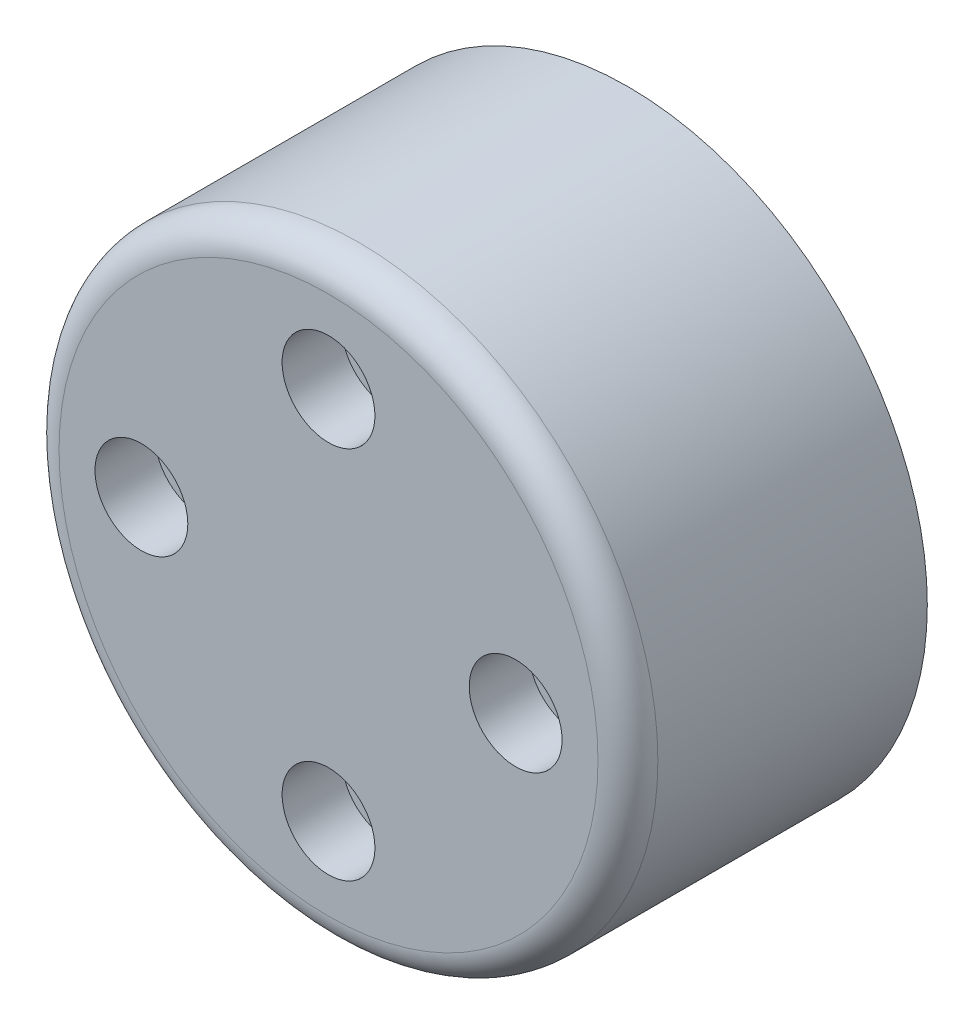
ISO-10303-21;
HEADER;
FILE_DESCRIPTION(('STEP AP214'),'2;1');
FILE_NAME('part.step','',(''),(''),'','','');
FILE_SCHEMA(('AUTOMOTIVE_DESIGN { 1 0 10303 214 1 1 1 1 }'));
ENDSEC;
DATA;
#1=APPLICATION_CONTEXT('core data for automotive mechanical design processes');
#2=APPLICATION_PROTOCOL_DEFINITION('international standard','automotive_design',2000,#1);
#3=PRODUCT_CONTEXT('',#1,'mechanical');
#4=PRODUCT('Part','Part','',(#3));
#5=PRODUCT_RELATED_PRODUCT_CATEGORY('part','',(#4));
#6=PRODUCT_DEFINITION_FORMATION('','',#4);
#7=PRODUCT_DEFINITION_CONTEXT('part definition',#1,'design');
#8=PRODUCT_DEFINITION('design','',#6,#7);
#9=PRODUCT_DEFINITION_SHAPE('','',#8);
#10=(LENGTH_UNIT() NAMED_UNIT(*) SI_UNIT(.MILLI.,.METRE.));
#11=(NAMED_UNIT(*) PLANE_ANGLE_UNIT() SI_UNIT($,.RADIAN.));
#12=(NAMED_UNIT(*) SI_UNIT($,.STERADIAN.) SOLID_ANGLE_UNIT());
#13=UNCERTAINTY_MEASURE_WITH_UNIT(LENGTH_MEASURE(1.E-05),#10,'distance_accuracy_value','');
#14=(GEOMETRIC_REPRESENTATION_CONTEXT(3) GLOBAL_UNCERTAINTY_ASSIGNED_CONTEXT((#13)) GLOBAL_UNIT_ASSIGNED_CONTEXT((#10,
#11,#12)) REPRESENTATION_CONTEXT('',''));
#15=CARTESIAN_POINT('',(0.,0.,0.));
#16=DIRECTION('',(0.,0.,1.));
#17=DIRECTION('',(1.,0.,0.));
#18=AXIS2_PLACEMENT_3D('',#15,#16,#17);
#19=CARTESIAN_POINT('',(12.5,0.,20.));
#20=DIRECTION('',(0.,0.,-1.));
#21=DIRECTION('',(-1.,0.,0.));
#22=AXIS2_PLACEMENT_3D('',#19,#20,#21);
#23=CYLINDRICAL_SURFACE('',#22,1.6);
#24=CARTESIAN_POINT('',(12.5,0.,0.));
#25=DIRECTION('',(0.,0.,1.));
#26=DIRECTION('',(1.,0.,0.));
#27=AXIS2_PLACEMENT_3D('',#24,#25,#26);
#28=CIRCLE('',#27,1.6);
#29=CARTESIAN_POINT('',(14.1,0.,0.));
#30=VERTEX_POINT('',#29);
#31=EDGE_CURVE('E58',#30,#30,#28,.T.);
#32=ORIENTED_EDGE('',*,*,#31,.F.);
#33=EDGE_LOOP('',(#32));
#34=FACE_BOUND('',#33,.T.);
#35=CARTESIAN_POINT('',(12.5,0.,16.));
#36=DIRECTION('',(0.,0.,1.));
#37=DIRECTION('',(1.,0.,0.));
#38=AXIS2_PLACEMENT_3D('',#35,#36,#37);
#39=CIRCLE('',#38,1.6);
#40=CARTESIAN_POINT('',(14.1,0.,16.));
#41=VERTEX_POINT('',#40);
#42=EDGE_CURVE('E61',#41,#41,#39,.T.);
#43=ORIENTED_EDGE('',*,*,#42,.T.);
#44=EDGE_LOOP('',(#43));
#45=FACE_BOUND('',#44,.T.);
#46=ADVANCED_FACE('F40',(#34,#45),#23,.F.);
#47=CARTESIAN_POINT('',(0.,-12.5,20.));
#48=DIRECTION('',(0.,0.,-1.));
#49=DIRECTION('',(-1.,0.,0.));
#50=AXIS2_PLACEMENT_3D('',#47,#48,#49);
#51=CYLINDRICAL_SURFACE('',#50,1.6);
#52=CARTESIAN_POINT('',(0.,-12.5,0.));
#53=DIRECTION('',(0.,0.,1.));
#54=DIRECTION('',(1.,0.,0.));
#55=AXIS2_PLACEMENT_3D('',#52,#53,#54);
#56=CIRCLE('',#55,1.6);
#57=CARTESIAN_POINT('',(1.6,-12.5,0.));
#58=VERTEX_POINT('',#57);
#59=EDGE_CURVE('E82',#58,#58,#56,.T.);
#60=ORIENTED_EDGE('',*,*,#59,.F.);
#61=EDGE_LOOP('',(#60));
#62=FACE_BOUND('',#61,.T.);
#63=CARTESIAN_POINT('',(0.,-12.5,16.));
#64=DIRECTION('',(0.,0.,1.));
#65=DIRECTION('',(1.,0.,0.));
#66=AXIS2_PLACEMENT_3D('',#63,#64,#65);
#67=CIRCLE('',#66,1.6);
#68=CARTESIAN_POINT('',(1.6,-12.5,16.));
#69=VERTEX_POINT('',#68);
#70=EDGE_CURVE('E66',#69,#69,#67,.T.);
#71=ORIENTED_EDGE('',*,*,#70,.T.);
#72=EDGE_LOOP('',(#71));
#73=FACE_BOUND('',#72,.T.);
#74=ADVANCED_FACE('F207',(#62,#73),#51,.F.);
#75=CARTESIAN_POINT('',(-12.5,0.,20.));
#76=DIRECTION('',(0.,0.,-1.));
#77=DIRECTION('',(-1.,0.,0.));
#78=AXIS2_PLACEMENT_3D('',#75,#76,#77);
#79=CYLINDRICAL_SURFACE('',#78,1.6);
#80=CARTESIAN_POINT('',(-12.5,0.,0.));
#81=DIRECTION('',(0.,0.,1.));
#82=DIRECTION('',(-1.,0.,0.));
#83=AXIS2_PLACEMENT_3D('',#80,#81,#82);
#84=CIRCLE('',#83,1.6);
#85=CARTESIAN_POINT('',(-14.1,0.,0.));
#86=VERTEX_POINT('',#85);
#87=EDGE_CURVE('E86',#86,#86,#84,.T.);
#88=ORIENTED_EDGE('',*,*,#87,.F.);
#89=EDGE_LOOP('',(#88));
#90=FACE_BOUND('',#89,.T.);
#91=CARTESIAN_POINT('',(-12.5,0.,16.));
#92=DIRECTION('',(0.,0.,1.));
#93=DIRECTION('',(1.,0.,0.));
#94=AXIS2_PLACEMENT_3D('',#91,#92,#93);
#95=CIRCLE('',#94,1.6);
#96=CARTESIAN_POINT('',(-10.9,0.,16.));
#97=VERTEX_POINT('',#96);
#98=EDGE_CURVE('E70',#97,#97,#95,.T.);
#99=ORIENTED_EDGE('',*,*,#98,.T.);
#100=EDGE_LOOP('',(#99));
#101=FACE_BOUND('',#100,.T.);
#102=ADVANCED_FACE('F181',(#90,#101),#79,.F.);
#103=CARTESIAN_POINT('',(0.,12.5,20.));
#104=DIRECTION('',(0.,0.,-1.));
#105=DIRECTION('',(-1.,0.,0.));
#106=AXIS2_PLACEMENT_3D('',#103,#104,#105);
#107=CYLINDRICAL_SURFACE('',#106,1.6);
#108=CARTESIAN_POINT('',(0.,12.5,0.));
#109=DIRECTION('',(0.,0.,1.));
#110=DIRECTION('',(-1.,0.,0.));
#111=AXIS2_PLACEMENT_3D('',#108,#109,#110);
#112=CIRCLE('',#111,1.6);
#113=CARTESIAN_POINT('',(-1.6,12.5,0.));
#114=VERTEX_POINT('',#113);
#115=EDGE_CURVE('E65',#114,#114,#112,.T.);
#116=ORIENTED_EDGE('',*,*,#115,.F.);
#117=EDGE_LOOP('',(#116));
#118=FACE_BOUND('',#117,.T.);
#119=CARTESIAN_POINT('',(0.,12.5,16.));
#120=DIRECTION('',(0.,0.,1.));
#121=DIRECTION('',(1.,0.,0.));
#122=AXIS2_PLACEMENT_3D('',#119,#120,#121);
#123=CIRCLE('',#122,1.6);
#124=CARTESIAN_POINT('',(1.6,12.5,16.));
#125=VERTEX_POINT('',#124);
#126=EDGE_CURVE('E74',#125,#125,#123,.T.);
#127=ORIENTED_EDGE('',*,*,#126,.T.);
#128=EDGE_LOOP('',(#127));
#129=FACE_BOUND('',#128,.T.);
#130=ADVANCED_FACE('F178',(#118,#129),#107,.F.);
#131=CARTESIAN_POINT('',(0.,0.,20.));
#132=DIRECTION('',(0.,0.,1.));
#133=DIRECTION('',(1.,0.,0.));
#134=AXIS2_PLACEMENT_3D('',#131,#132,#133);
#135=PLANE('',#134);
#136=CARTESIAN_POINT('',(0.,0.,20.));
#137=DIRECTION('',(0.,0.,1.));
#138=DIRECTION('',(1.,0.,0.));
#139=AXIS2_PLACEMENT_3D('',#136,#137,#138);
#140=CIRCLE('',#139,18.);
#141=CARTESIAN_POINT('',(18.,0.,20.));
#142=VERTEX_POINT('',#141);
#143=EDGE_CURVE('E48',#142,#142,#140,.T.);
#144=ORIENTED_EDGE('',*,*,#143,.T.);
#145=EDGE_LOOP('',(#144));
#146=FACE_BOUND('',#145,.T.);
#147=CARTESIAN_POINT('',(-12.5,0.,20.));
#148=DIRECTION('',(0.,0.,1.));
#149=DIRECTION('',(1.,0.,0.));
#150=AXIS2_PLACEMENT_3D('',#147,#148,#149);
#151=CIRCLE('',#150,3.1);
#152=CARTESIAN_POINT('',(-9.4,0.,20.));
#153=VERTEX_POINT('',#152);
#154=EDGE_CURVE('E118',#153,#153,#151,.T.);
#155=ORIENTED_EDGE('',*,*,#154,.F.);
#156=EDGE_LOOP('',(#155));
#157=FACE_BOUND('',#156,.T.);
#158=CARTESIAN_POINT('',(0.,-12.5,20.));
#159=DIRECTION('',(0.,0.,1.));
#160=DIRECTION('',(1.,0.,0.));
#161=AXIS2_PLACEMENT_3D('',#158,#159,#160);
#162=CIRCLE('',#161,3.1);
#163=CARTESIAN_POINT('',(3.1,-12.5,20.));
#164=VERTEX_POINT('',#163);
#165=EDGE_CURVE('E114',#164,#164,#162,.T.);
#166=ORIENTED_EDGE('',*,*,#165,.F.);
#167=EDGE_LOOP('',(#166));
#168=FACE_BOUND('',#167,.T.);
#169=CARTESIAN_POINT('',(12.5,0.,20.));
#170=DIRECTION('',(0.,0.,1.));
#171=DIRECTION('',(1.,0.,0.));
#172=AXIS2_PLACEMENT_3D('',#169,#170,#171);
#173=CIRCLE('',#172,3.1);
#174=CARTESIAN_POINT('',(15.6,0.,20.));
#175=VERTEX_POINT('',#174);
#176=EDGE_CURVE('E106',#175,#175,#173,.T.);
#177=ORIENTED_EDGE('',*,*,#176,.F.);
#178=EDGE_LOOP('',(#177));
#179=FACE_BOUND('',#178,.T.);
#180=CARTESIAN_POINT('',(0.,12.5,20.));
#181=DIRECTION('',(0.,0.,1.));
#182=DIRECTION('',(1.,0.,0.));
#183=AXIS2_PLACEMENT_3D('',#180,#181,#182);
#184=CIRCLE('',#183,3.1);
#185=CARTESIAN_POINT('',(3.1,12.5,20.));
#186=VERTEX_POINT('',#185);
#187=EDGE_CURVE('E97',#186,#186,#184,.T.);
#188=ORIENTED_EDGE('',*,*,#187,.F.);
#189=EDGE_LOOP('',(#188));
#190=FACE_BOUND('',#189,.T.);
#191=ADVANCED_FACE('F163',(#146,#157,#168,#179,#190),#135,.T.);
#192=CARTESIAN_POINT('',(0.,0.,0.));
#193=DIRECTION('',(0.,0.,1.));
#194=DIRECTION('',(1.,0.,0.));
#195=AXIS2_PLACEMENT_3D('',#192,#193,#194);
#196=PLANE('',#195);
#197=CARTESIAN_POINT('',(6.71751442127223,-6.71751442127217,0.));
#198=DIRECTION('',(0.,0.,-1.));
#199=DIRECTION('',(-1.,0.,0.));
#200=AXIS2_PLACEMENT_3D('',#197,#198,#199);
#201=CIRCLE('',#200,3.1);
#202=CARTESIAN_POINT('',(3.61751442127223,-6.71751442127217,0.));
#203=VERTEX_POINT('',#202);
#204=EDGE_CURVE('E137',#203,#203,#201,.T.);
#205=ORIENTED_EDGE('',*,*,#204,.F.);
#206=EDGE_LOOP('',(#205));
#207=FACE_BOUND('',#206,.T.);
#208=CARTESIAN_POINT('',(-6.71751442127219,-6.71751442127221,0.));
#209=DIRECTION('',(0.,0.,-1.));
#210=DIRECTION('',(-1.,0.,0.));
#211=AXIS2_PLACEMENT_3D('',#208,#209,#210);
#212=CIRCLE('',#211,3.1);
#213=CARTESIAN_POINT('',(-9.81751442127219,-6.71751442127221,0.));
#214=VERTEX_POINT('',#213);
#215=EDGE_CURVE('E145',#214,#214,#212,.T.);
#216=ORIENTED_EDGE('',*,*,#215,.F.);
#217=EDGE_LOOP('',(#216));
#218=FACE_BOUND('',#217,.T.);
#219=CARTESIAN_POINT('',(-6.71751442127218,6.71751442127217,0.));
#220=DIRECTION('',(0.,0.,-1.));
#221=DIRECTION('',(-1.,0.,0.));
#222=AXIS2_PLACEMENT_3D('',#219,#220,#221);
#223=CIRCLE('',#222,3.1);
#224=CARTESIAN_POINT('',(-9.81751442127218,6.71751442127217,0.));
#225=VERTEX_POINT('',#224);
#226=EDGE_CURVE('E129',#225,#225,#223,.T.);
#227=ORIENTED_EDGE('',*,*,#226,.F.);
#228=EDGE_LOOP('',(#227));
#229=FACE_BOUND('',#228,.T.);
#230=CARTESIAN_POINT('',(6.71751442127224,6.71751442127216,0.));
#231=DIRECTION('',(0.,0.,-1.));
#232=DIRECTION('',(-1.,0.,0.));
#233=AXIS2_PLACEMENT_3D('',#230,#231,#232);
#234=CIRCLE('',#233,3.1);
#235=CARTESIAN_POINT('',(3.61751442127224,6.71751442127216,0.));
#236=VERTEX_POINT('',#235);
#237=EDGE_CURVE('E125',#236,#236,#234,.T.);
#238=ORIENTED_EDGE('',*,*,#237,.F.);
#239=EDGE_LOOP('',(#238));
#240=FACE_BOUND('',#239,.T.);
#241=CARTESIAN_POINT('',(0.,0.,0.));
#242=DIRECTION('',(0.,0.,1.));
#243=DIRECTION('',(1.,0.,0.));
#244=AXIS2_PLACEMENT_3D('',#241,#242,#243);
#245=CIRCLE('',#244,20.);
#246=CARTESIAN_POINT('',(20.,0.,0.));
#247=VERTEX_POINT('',#246);
#248=EDGE_CURVE('E53',#247,#247,#245,.T.);
#249=ORIENTED_EDGE('',*,*,#248,.F.);
#250=EDGE_LOOP('',(#249));
#251=FACE_BOUND('',#250,.T.);
#252=ORIENTED_EDGE('',*,*,#31,.T.);
#253=EDGE_LOOP('',(#252));
#254=FACE_BOUND('',#253,.T.);
#255=ORIENTED_EDGE('',*,*,#59,.T.);
#256=EDGE_LOOP('',(#255));
#257=FACE_BOUND('',#256,.T.);
#258=ORIENTED_EDGE('',*,*,#87,.T.);
#259=EDGE_LOOP('',(#258));
#260=FACE_BOUND('',#259,.T.);
#261=ORIENTED_EDGE('',*,*,#115,.T.);
#262=EDGE_LOOP('',(#261));
#263=FACE_BOUND('',#262,.T.);
#264=ADVANCED_FACE('F159',(#207,#218,#229,#240,#251,#254,#257,#260,#263),#196,.F.);
#265=CARTESIAN_POINT('',(0.,0.,20.));
#266=DIRECTION('',(0.,0.,-1.));
#267=DIRECTION('',(-1.,0.,0.));
#268=AXIS2_PLACEMENT_3D('',#265,#266,#267);
#269=CYLINDRICAL_SURFACE('',#268,20.);
#270=CARTESIAN_POINT('',(0.,0.,18.));
#271=DIRECTION('',(0.,0.,1.));
#272=DIRECTION('',(1.,0.,0.));
#273=AXIS2_PLACEMENT_3D('',#270,#271,#272);
#274=CIRCLE('',#273,20.);
#275=CARTESIAN_POINT('',(20.,0.,18.));
#276=VERTEX_POINT('',#275);
#277=EDGE_CURVE('E10',#276,#276,#274,.F.);
#278=ORIENTED_EDGE('',*,*,#277,.T.);
#279=EDGE_LOOP('',(#278));
#280=FACE_BOUND('',#279,.T.);
#281=ORIENTED_EDGE('',*,*,#248,.T.);
#282=EDGE_LOOP('',(#281));
#283=FACE_BOUND('',#282,.T.);
#284=ADVANCED_FACE('F162',(#280,#283),#269,.T.);
#285=CARTESIAN_POINT('',(0.,12.5,16.));
#286=DIRECTION('',(0.,0.,1.));
#287=DIRECTION('',(1.,0.,0.));
#288=AXIS2_PLACEMENT_3D('',#285,#286,#287);
#289=CYLINDRICAL_SURFACE('',#288,3.1);
#290=CARTESIAN_POINT('',(0.,12.5,16.));
#291=DIRECTION('',(0.,0.,1.));
#292=DIRECTION('',(1.,0.,0.));
#293=AXIS2_PLACEMENT_3D('',#290,#291,#292);
#294=CIRCLE('',#293,3.1);
#295=CARTESIAN_POINT('',(3.1,12.5,16.));
#296=VERTEX_POINT('',#295);
#297=EDGE_CURVE('E93',#296,#296,#294,.T.);
#298=ORIENTED_EDGE('',*,*,#297,.F.);
#299=EDGE_LOOP('',(#298));
#300=FACE_BOUND('',#299,.T.);
#301=ORIENTED_EDGE('',*,*,#187,.T.);
#302=EDGE_LOOP('',(#301));
#303=FACE_BOUND('',#302,.T.);
#304=ADVANCED_FACE('F189',(#300,#303),#289,.F.);
#305=CARTESIAN_POINT('',(0.,12.5,16.));
#306=DIRECTION('',(0.,0.,1.));
#307=DIRECTION('',(1.,0.,0.));
#308=AXIS2_PLACEMENT_3D('',#305,#306,#307);
#309=PLANE('',#308);
#310=ORIENTED_EDGE('',*,*,#126,.F.);
#311=EDGE_LOOP('',(#310));
#312=FACE_BOUND('',#311,.T.);
#313=ORIENTED_EDGE('',*,*,#297,.T.);
#314=EDGE_LOOP('',(#313));
#315=FACE_BOUND('',#314,.T.);
#316=ADVANCED_FACE('F185',(#312,#315),#309,.T.);
#317=CARTESIAN_POINT('',(-12.5,0.,16.));
#318=DIRECTION('',(0.,0.,1.));
#319=DIRECTION('',(1.,0.,0.));
#320=AXIS2_PLACEMENT_3D('',#317,#318,#319);
#321=CYLINDRICAL_SURFACE('',#320,3.1);
#322=CARTESIAN_POINT('',(-12.5,0.,16.));
#323=DIRECTION('',(0.,0.,1.));
#324=DIRECTION('',(1.,0.,0.));
#325=AXIS2_PLACEMENT_3D('',#322,#323,#324);
#326=CIRCLE('',#325,3.1);
#327=CARTESIAN_POINT('',(-9.4,0.,16.));
#328=VERTEX_POINT('',#327);
#329=EDGE_CURVE('E77',#328,#328,#326,.T.);
#330=ORIENTED_EDGE('',*,*,#329,.F.);
#331=EDGE_LOOP('',(#330));
#332=FACE_BOUND('',#331,.T.);
#333=ORIENTED_EDGE('',*,*,#154,.T.);
#334=EDGE_LOOP('',(#333));
#335=FACE_BOUND('',#334,.T.);
#336=ADVANCED_FACE('F188',(#332,#335),#321,.F.);
#337=CARTESIAN_POINT('',(-12.5,0.,16.));
#338=DIRECTION('',(0.,0.,1.));
#339=DIRECTION('',(1.,0.,0.));
#340=AXIS2_PLACEMENT_3D('',#337,#338,#339);
#341=PLANE('',#340);
#342=ORIENTED_EDGE('',*,*,#98,.F.);
#343=EDGE_LOOP('',(#342));
#344=FACE_BOUND('',#343,.T.);
#345=ORIENTED_EDGE('',*,*,#329,.T.);
#346=EDGE_LOOP('',(#345));
#347=FACE_BOUND('',#346,.T.);
#348=ADVANCED_FACE('F235',(#344,#347),#341,.T.);
#349=CARTESIAN_POINT('',(0.,-12.5,16.));
#350=DIRECTION('',(0.,0.,1.));
#351=DIRECTION('',(1.,0.,0.));
#352=AXIS2_PLACEMENT_3D('',#349,#350,#351);
#353=CYLINDRICAL_SURFACE('',#352,3.1);
#354=CARTESIAN_POINT('',(0.,-12.5,16.));
#355=DIRECTION('',(0.,0.,1.));
#356=DIRECTION('',(1.,0.,0.));
#357=AXIS2_PLACEMENT_3D('',#354,#355,#356);
#358=CIRCLE('',#357,3.1);
#359=CARTESIAN_POINT('',(3.1,-12.5,16.));
#360=VERTEX_POINT('',#359);
#361=EDGE_CURVE('E110',#360,#360,#358,.T.);
#362=ORIENTED_EDGE('',*,*,#361,.F.);
#363=EDGE_LOOP('',(#362));
#364=FACE_BOUND('',#363,.T.);
#365=ORIENTED_EDGE('',*,*,#165,.T.);
#366=EDGE_LOOP('',(#365));
#367=FACE_BOUND('',#366,.T.);
#368=ADVANCED_FACE('F231',(#364,#367),#353,.F.);
#369=CARTESIAN_POINT('',(0.,-12.5,16.));
#370=DIRECTION('',(0.,0.,1.));
#371=DIRECTION('',(1.,0.,0.));
#372=AXIS2_PLACEMENT_3D('',#369,#370,#371);
#373=PLANE('',#372);
#374=ORIENTED_EDGE('',*,*,#70,.F.);
#375=EDGE_LOOP('',(#374));
#376=FACE_BOUND('',#375,.T.);
#377=ORIENTED_EDGE('',*,*,#361,.T.);
#378=EDGE_LOOP('',(#377));
#379=FACE_BOUND('',#378,.T.);
#380=ADVANCED_FACE('F227',(#376,#379),#373,.T.);
#381=CARTESIAN_POINT('',(12.5,0.,16.));
#382=DIRECTION('',(0.,0.,1.));
#383=DIRECTION('',(1.,0.,0.));
#384=AXIS2_PLACEMENT_3D('',#381,#382,#383);
#385=CYLINDRICAL_SURFACE('',#384,3.1);
#386=CARTESIAN_POINT('',(12.5,0.,16.));
#387=DIRECTION('',(0.,0.,1.));
#388=DIRECTION('',(1.,0.,0.));
#389=AXIS2_PLACEMENT_3D('',#386,#387,#388);
#390=CIRCLE('',#389,3.1);
#391=CARTESIAN_POINT('',(15.6,0.,16.));
#392=VERTEX_POINT('',#391);
#393=EDGE_CURVE('E102',#392,#392,#390,.T.);
#394=ORIENTED_EDGE('',*,*,#393,.F.);
#395=EDGE_LOOP('',(#394));
#396=FACE_BOUND('',#395,.T.);
#397=ORIENTED_EDGE('',*,*,#176,.T.);
#398=EDGE_LOOP('',(#397));
#399=FACE_BOUND('',#398,.T.);
#400=ADVANCED_FACE('F223',(#396,#399),#385,.F.);
#401=CARTESIAN_POINT('',(12.5,0.,16.));
#402=DIRECTION('',(0.,0.,1.));
#403=DIRECTION('',(1.,0.,0.));
#404=AXIS2_PLACEMENT_3D('',#401,#402,#403);
#405=PLANE('',#404);
#406=ORIENTED_EDGE('',*,*,#42,.F.);
#407=EDGE_LOOP('',(#406));
#408=FACE_BOUND('',#407,.T.);
#409=ORIENTED_EDGE('',*,*,#393,.T.);
#410=EDGE_LOOP('',(#409));
#411=FACE_BOUND('',#410,.T.);
#412=ADVANCED_FACE('F219',(#408,#411),#405,.T.);
#413=CARTESIAN_POINT('',(6.71751442127224,6.71751442127216,5.));
#414=DIRECTION('',(0.,0.,-1.));
#415=DIRECTION('',(-1.,0.,0.));
#416=AXIS2_PLACEMENT_3D('',#413,#414,#415);
#417=CYLINDRICAL_SURFACE('',#416,3.1);
#418=CARTESIAN_POINT('',(6.71751442127224,6.71751442127216,5.));
#419=DIRECTION('',(0.,0.,-1.));
#420=DIRECTION('',(-1.,0.,0.));
#421=AXIS2_PLACEMENT_3D('',#418,#419,#420);
#422=CIRCLE('',#421,3.1);
#423=CARTESIAN_POINT('',(3.61751442127224,6.71751442127216,5.));
#424=VERTEX_POINT('',#423);
#425=EDGE_CURVE('E98',#424,#424,#422,.T.);
#426=ORIENTED_EDGE('',*,*,#425,.F.);
#427=EDGE_LOOP('',(#426));
#428=FACE_BOUND('',#427,.T.);
#429=ORIENTED_EDGE('',*,*,#237,.T.);
#430=EDGE_LOOP('',(#429));
#431=FACE_BOUND('',#430,.T.);
#432=ADVANCED_FACE('F222',(#428,#431),#417,.F.);
#433=CARTESIAN_POINT('',(6.71751442127224,6.71751442127216,5.));
#434=DIRECTION('',(0.,0.,-1.));
#435=DIRECTION('',(-1.,0.,0.));
#436=AXIS2_PLACEMENT_3D('',#433,#434,#435);
#437=PLANE('',#436);
#438=ORIENTED_EDGE('',*,*,#425,.T.);
#439=EDGE_LOOP('',(#438));
#440=FACE_BOUND('',#439,.T.);
#441=ADVANCED_FACE('F245',(#440),#437,.T.);
#442=CARTESIAN_POINT('',(-6.71751442127218,6.71751442127217,5.));
#443=DIRECTION('',(0.,0.,-1.));
#444=DIRECTION('',(-1.,0.,0.));
#445=AXIS2_PLACEMENT_3D('',#442,#443,#444);
#446=CYLINDRICAL_SURFACE('',#445,3.1);
#447=CARTESIAN_POINT('',(-6.71751442127218,6.71751442127217,5.));
#448=DIRECTION('',(0.,0.,-1.));
#449=DIRECTION('',(-1.,0.,0.));
#450=AXIS2_PLACEMENT_3D('',#447,#448,#449);
#451=CIRCLE('',#450,3.1);
#452=CARTESIAN_POINT('',(-9.81751442127218,6.71751442127217,5.));
#453=VERTEX_POINT('',#452);
#454=EDGE_CURVE('E149',#453,#453,#451,.T.);
#455=ORIENTED_EDGE('',*,*,#454,.F.);
#456=EDGE_LOOP('',(#455));
#457=FACE_BOUND('',#456,.T.);
#458=ORIENTED_EDGE('',*,*,#226,.T.);
#459=EDGE_LOOP('',(#458));
#460=FACE_BOUND('',#459,.T.);
#461=ADVANCED_FACE('F157',(#457,#460),#446,.F.);
#462=CARTESIAN_POINT('',(-6.71751442127218,6.71751442127217,5.));
#463=DIRECTION('',(0.,0.,-1.));
#464=DIRECTION('',(-1.,0.,0.));
#465=AXIS2_PLACEMENT_3D('',#462,#463,#464);
#466=PLANE('',#465);
#467=ORIENTED_EDGE('',*,*,#454,.T.);
#468=EDGE_LOOP('',(#467));
#469=FACE_BOUND('',#468,.T.);
#470=ADVANCED_FACE('F265',(#469),#466,.T.);
#471=CARTESIAN_POINT('',(-6.71751442127219,-6.71751442127221,5.));
#472=DIRECTION('',(0.,0.,-1.));
#473=DIRECTION('',(-1.,0.,0.));
#474=AXIS2_PLACEMENT_3D('',#471,#472,#473);
#475=CYLINDRICAL_SURFACE('',#474,3.1);
#476=CARTESIAN_POINT('',(-6.71751442127219,-6.71751442127221,5.));
#477=DIRECTION('',(0.,0.,-1.));
#478=DIRECTION('',(-1.,0.,0.));
#479=AXIS2_PLACEMENT_3D('',#476,#477,#478);
#480=CIRCLE('',#479,3.1);
#481=CARTESIAN_POINT('',(-9.81751442127219,-6.71751442127221,5.));
#482=VERTEX_POINT('',#481);
#483=EDGE_CURVE('E141',#482,#482,#480,.T.);
#484=ORIENTED_EDGE('',*,*,#483,.F.);
#485=EDGE_LOOP('',(#484));
#486=FACE_BOUND('',#485,.T.);
#487=ORIENTED_EDGE('',*,*,#215,.T.);
#488=EDGE_LOOP('',(#487));
#489=FACE_BOUND('',#488,.T.);
#490=ADVANCED_FACE('F261',(#486,#489),#475,.F.);
#491=CARTESIAN_POINT('',(-6.71751442127219,-6.71751442127221,5.));
#492=DIRECTION('',(0.,0.,-1.));
#493=DIRECTION('',(-1.,0.,0.));
#494=AXIS2_PLACEMENT_3D('',#491,#492,#493);
#495=PLANE('',#494);
#496=ORIENTED_EDGE('',*,*,#483,.T.);
#497=EDGE_LOOP('',(#496));
#498=FACE_BOUND('',#497,.T.);
#499=ADVANCED_FACE('F257',(#498),#495,.T.);
#500=CARTESIAN_POINT('',(6.71751442127223,-6.71751442127217,5.));
#501=DIRECTION('',(0.,0.,-1.));
#502=DIRECTION('',(-1.,0.,0.));
#503=AXIS2_PLACEMENT_3D('',#500,#501,#502);
#504=CYLINDRICAL_SURFACE('',#503,3.1);
#505=CARTESIAN_POINT('',(6.71751442127223,-6.71751442127217,5.));
#506=DIRECTION('',(0.,0.,-1.));
#507=DIRECTION('',(-1.,0.,0.));
#508=AXIS2_PLACEMENT_3D('',#505,#506,#507);
#509=CIRCLE('',#508,3.1);
#510=CARTESIAN_POINT('',(3.61751442127223,-6.71751442127217,5.));
#511=VERTEX_POINT('',#510);
#512=EDGE_CURVE('E133',#511,#511,#509,.T.);
#513=ORIENTED_EDGE('',*,*,#512,.F.);
#514=EDGE_LOOP('',(#513));
#515=FACE_BOUND('',#514,.T.);
#516=ORIENTED_EDGE('',*,*,#204,.T.);
#517=EDGE_LOOP('',(#516));
#518=FACE_BOUND('',#517,.T.);
#519=ADVANCED_FACE('F253',(#515,#518),#504,.F.);
#520=CARTESIAN_POINT('',(6.71751442127223,-6.71751442127217,5.));
#521=DIRECTION('',(0.,0.,-1.));
#522=DIRECTION('',(-1.,0.,0.));
#523=AXIS2_PLACEMENT_3D('',#520,#521,#522);
#524=PLANE('',#523);
#525=ORIENTED_EDGE('',*,*,#512,.T.);
#526=EDGE_LOOP('',(#525));
#527=FACE_BOUND('',#526,.T.);
#528=ADVANCED_FACE('F250',(#527),#524,.T.);
#529=CARTESIAN_POINT('',(0.,0.,18.));
#530=DIRECTION('',(0.,0.,1.));
#531=DIRECTION('',(1.,0.,0.));
#532=AXIS2_PLACEMENT_3D('',#529,#530,#531);
#533=TOROIDAL_SURFACE('',#532,18.,2.);
#534=ORIENTED_EDGE('',*,*,#277,.F.);
#535=EDGE_LOOP('',(#534));
#536=FACE_BOUND('',#535,.T.);
#537=ORIENTED_EDGE('',*,*,#143,.F.);
#538=EDGE_LOOP('',(#537));
#539=FACE_BOUND('',#538,.T.);
#540=ADVANCED_FACE('F42',(#536,#539),#533,.T.);
#541=CLOSED_SHELL('',(#46,#74,#102,#130,#191,#264,#284,#304,#316,#336,#348,#368,#380,#400,#412,
#432,#441,#461,#470,#490,#499,#519,#528,#540));
#542=MANIFOLD_SOLID_BREP('B2',#541);
#543=ADVANCED_BREP_SHAPE_REPRESENTATION('',(#18,#542),#14);
#544=SHAPE_DEFINITION_REPRESENTATION(#9,#543);
ENDSEC;
END-ISO-10303-21;
